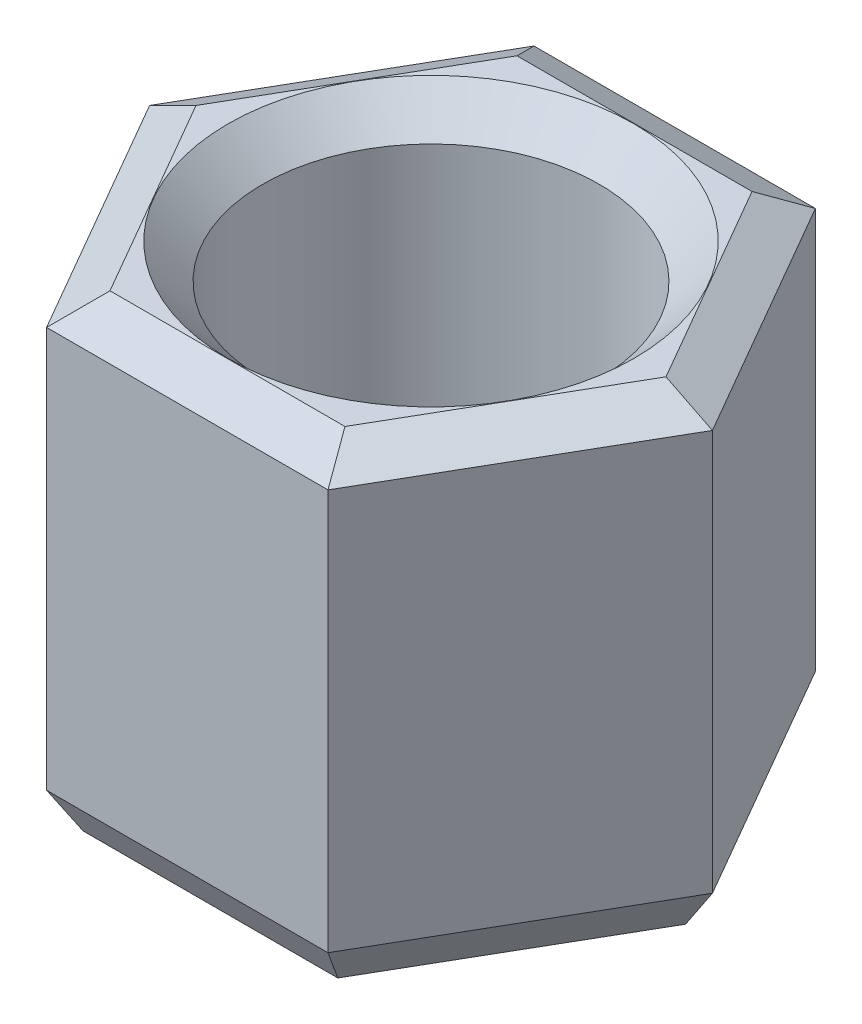
ISO-10303-21;
HEADER;
FILE_DESCRIPTION(('STEP AP214'),'2;1');
FILE_NAME('part.step','',(''),(''),'','','');
FILE_SCHEMA(('AUTOMOTIVE_DESIGN { 1 0 10303 214 1 1 1 1 }'));
ENDSEC;
DATA;
#1=APPLICATION_CONTEXT('core data for automotive mechanical design processes');
#2=APPLICATION_PROTOCOL_DEFINITION('international standard','automotive_design',2000,#1);
#3=PRODUCT_CONTEXT('',#1,'mechanical');
#4=PRODUCT('Part','Part','',(#3));
#5=PRODUCT_RELATED_PRODUCT_CATEGORY('part','',(#4));
#6=PRODUCT_DEFINITION_FORMATION('','',#4);
#7=PRODUCT_DEFINITION_CONTEXT('part definition',#1,'design');
#8=PRODUCT_DEFINITION('design','',#6,#7);
#9=PRODUCT_DEFINITION_SHAPE('','',#8);
#10=(LENGTH_UNIT() NAMED_UNIT(*) SI_UNIT(.MILLI.,.METRE.));
#11=(NAMED_UNIT(*) PLANE_ANGLE_UNIT() SI_UNIT($,.RADIAN.));
#12=(NAMED_UNIT(*) SI_UNIT($,.STERADIAN.) SOLID_ANGLE_UNIT());
#13=UNCERTAINTY_MEASURE_WITH_UNIT(LENGTH_MEASURE(1.E-05),#10,'distance_accuracy_value','');
#14=(GEOMETRIC_REPRESENTATION_CONTEXT(3) GLOBAL_UNCERTAINTY_ASSIGNED_CONTEXT((#13)) GLOBAL_UNIT_ASSIGNED_CONTEXT((#10,
#11,#12)) REPRESENTATION_CONTEXT('',''));
#15=CARTESIAN_POINT('',(0.,0.,0.));
#16=DIRECTION('',(0.,0.,1.));
#17=DIRECTION('',(1.,0.,0.));
#18=AXIS2_PLACEMENT_3D('',#15,#16,#17);
#19=CARTESIAN_POINT('',(0.,10.,0.));
#20=DIRECTION('',(0.,1.,0.));
#21=DIRECTION('',(0.,0.,1.));
#22=AXIS2_PLACEMENT_3D('',#19,#20,#21);
#23=CONICAL_SURFACE('',#22,8.75,0.785398163397449);
#24=CARTESIAN_POINT('',(0.,10.,0.));
#25=DIRECTION('',(0.,1.,0.));
#26=DIRECTION('',(0.,0.,1.));
#27=AXIS2_PLACEMENT_3D('',#24,#25,#26);
#28=CIRCLE('',#27,8.75);
#29=CARTESIAN_POINT('',(0.,10.,8.75));
#30=VERTEX_POINT('',#29);
#31=EDGE_CURVE('E265',#30,#30,#28,.F.);
#32=ORIENTED_EDGE('',*,*,#31,.F.);
#33=EDGE_LOOP('',(#32));
#34=FACE_BOUND('',#33,.T.);
#35=CARTESIAN_POINT('',(0.,8.5,0.));
#36=DIRECTION('',(0.,1.,0.));
#37=DIRECTION('',(0.,0.,1.));
#38=AXIS2_PLACEMENT_3D('',#35,#36,#37);
#39=CIRCLE('',#38,7.25);
#40=CARTESIAN_POINT('',(0.,8.5,7.25));
#41=VERTEX_POINT('',#40);
#42=EDGE_CURVE('E149',#41,#41,#39,.T.);
#43=ORIENTED_EDGE('',*,*,#42,.F.);
#44=EDGE_LOOP('',(#43));
#45=FACE_BOUND('',#44,.T.);
#46=ADVANCED_FACE('F39',(#34,#45),#23,.F.);
#47=CARTESIAN_POINT('',(0.,10.,0.));
#48=DIRECTION('',(0.,1.,0.));
#49=DIRECTION('',(0.,0.,1.));
#50=AXIS2_PLACEMENT_3D('',#47,#48,#49);
#51=PLANE('',#50);
#52=DIRECTION('',(-1.,0.,0.));
#53=VECTOR('',#52,1.);
#54=CARTESIAN_POINT('',(-6.06217782649118,10.,-8.76794919243106));
#55=LINE('',#54,#53);
#56=CARTESIAN_POINT('',(5.062177826491,10.,-8.76794919243118));
#57=VERTEX_POINT('',#56);
#58=CARTESIAN_POINT('',(-5.06217782649119,10.,-8.76794919243108));
#59=VERTEX_POINT('',#58);
#60=EDGE_CURVE('E154',#57,#59,#55,.T.);
#61=ORIENTED_EDGE('',*,*,#60,.T.);
#62=DIRECTION('',(-0.499999999999995,0.,0.866025403784441));
#63=VECTOR('',#62,1.);
#64=CARTESIAN_POINT('',(-10.6243556529822,10.,0.866025403784428));
#65=LINE('',#64,#63);
#66=CARTESIAN_POINT('',(-10.1243556529822,10.,0.));
#67=VERTEX_POINT('',#66);
#68=EDGE_CURVE('E134',#59,#67,#65,.T.);
#69=ORIENTED_EDGE('',*,*,#68,.T.);
#70=DIRECTION('',(0.500000000000001,0.,0.866025403784438));
#71=VECTOR('',#70,1.);
#72=CARTESIAN_POINT('',(-4.56217782649106,10.,9.63397459621559));
#73=LINE('',#72,#71);
#74=CARTESIAN_POINT('',(-5.06217782649106,10.,8.76794919243114));
#75=VERTEX_POINT('',#74);
#76=EDGE_CURVE('E142',#67,#75,#73,.T.);
#77=ORIENTED_EDGE('',*,*,#76,.T.);
#78=DIRECTION('',(1.,0.,0.));
#79=VECTOR('',#78,1.);
#80=CARTESIAN_POINT('',(6.06217782649112,10.,8.76794919243111));
#81=LINE('',#80,#79);
#82=CARTESIAN_POINT('',(5.06217782649112,10.,8.76794919243111));
#83=VERTEX_POINT('',#82);
#84=EDGE_CURVE('E148',#75,#83,#81,.T.);
#85=ORIENTED_EDGE('',*,*,#84,.T.);
#86=DIRECTION('',(0.499999999999995,0.,-0.866025403784442));
#87=VECTOR('',#86,1.);
#88=CARTESIAN_POINT('',(10.6243556529821,10.,-0.866025403784512));
#89=LINE('',#88,#87);
#90=CARTESIAN_POINT('',(10.1243556529822,10.,0.));
#91=VERTEX_POINT('',#90);
#92=EDGE_CURVE('E271',#83,#91,#89,.T.);
#93=ORIENTED_EDGE('',*,*,#92,.T.);
#94=DIRECTION('',(-0.500000000000007,0.,-0.866025403784435));
#95=VECTOR('',#94,1.);
#96=CARTESIAN_POINT('',(4.56217782649099,10.,-9.63397459621562));
#97=LINE('',#96,#95);
#98=EDGE_CURVE('E160',#91,#57,#97,.T.);
#99=ORIENTED_EDGE('',*,*,#98,.T.);
#100=EDGE_LOOP('',(#61,#69,#77,#85,#93,#99));
#101=FACE_BOUND('',#100,.T.);
#102=ORIENTED_EDGE('',*,*,#31,.T.);
#103=EDGE_LOOP('',(#102));
#104=FACE_BOUND('',#103,.T.);
#105=ADVANCED_FACE('F151',(#101,#104),#51,.T.);
#106=CARTESIAN_POINT('',(0.,-10.,0.));
#107=DIRECTION('',(0.,1.,0.));
#108=DIRECTION('',(0.,0.,1.));
#109=AXIS2_PLACEMENT_3D('',#106,#107,#108);
#110=PLANE('',#109);
#111=DIRECTION('',(-0.500000000000001,0.,-0.866025403784438));
#112=VECTOR('',#111,1.);
#113=CARTESIAN_POINT('',(-8.22724133595216,-10.,4.75000000000001));
#114=LINE('',#113,#112);
#115=CARTESIAN_POINT('',(-5.48482755730143,-10.,9.50000000000002));
#116=VERTEX_POINT('',#115);
#117=CARTESIAN_POINT('',(-10.9696551146029,-10.,0.));
#118=VERTEX_POINT('',#117);
#119=EDGE_CURVE('E49',#116,#118,#114,.T.);
#120=ORIENTED_EDGE('',*,*,#119,.T.);
#121=DIRECTION('',(0.499999999999995,0.,-0.866025403784441));
#122=VECTOR('',#121,1.);
#123=CARTESIAN_POINT('',(-8.22724133595223,-10.,-4.74999999999997));
#124=LINE('',#123,#122);
#125=CARTESIAN_POINT('',(-5.48482755730156,-10.,-9.49999999999994));
#126=VERTEX_POINT('',#125);
#127=EDGE_CURVE('E13',#118,#126,#124,.T.);
#128=ORIENTED_EDGE('',*,*,#127,.T.);
#129=DIRECTION('',(1.,0.,0.));
#130=VECTOR('',#129,1.);
#131=CARTESIAN_POINT('',(0.,-10.,-9.5));
#132=LINE('',#131,#130);
#133=CARTESIAN_POINT('',(5.48482755730136,-10.,-9.50000000000006));
#134=VERTEX_POINT('',#133);
#135=EDGE_CURVE('E185',#126,#134,#132,.T.);
#136=ORIENTED_EDGE('',*,*,#135,.T.);
#137=DIRECTION('',(0.500000000000007,0.,0.866025403784435));
#138=VECTOR('',#137,1.);
#139=CARTESIAN_POINT('',(8.22724133595213,-10.,-4.75000000000006));
#140=LINE('',#139,#138);
#141=CARTESIAN_POINT('',(10.9696551146029,-10.,0.));
#142=VERTEX_POINT('',#141);
#143=EDGE_CURVE('E187',#134,#142,#140,.T.);
#144=ORIENTED_EDGE('',*,*,#143,.T.);
#145=DIRECTION('',(-0.499999999999995,0.,0.866025403784442));
#146=VECTOR('',#145,1.);
#147=CARTESIAN_POINT('',(8.2272413359522,-10.,4.74999999999995));
#148=LINE('',#147,#146);
#149=CARTESIAN_POINT('',(5.48482755730149,-10.,9.49999999999998));
#150=VERTEX_POINT('',#149);
#151=EDGE_CURVE('E189',#142,#150,#148,.T.);
#152=ORIENTED_EDGE('',*,*,#151,.T.);
#153=DIRECTION('',(-1.,0.,0.));
#154=VECTOR('',#153,1.);
#155=CARTESIAN_POINT('',(0.,-10.,9.5));
#156=LINE('',#155,#154);
#157=EDGE_CURVE('E60',#150,#116,#156,.T.);
#158=ORIENTED_EDGE('',*,*,#157,.T.);
#159=EDGE_LOOP('',(#120,#128,#136,#144,#152,#158));
#160=FACE_BOUND('',#159,.T.);
#161=CARTESIAN_POINT('',(0.,-10.,0.));
#162=DIRECTION('',(0.,1.,0.));
#163=DIRECTION('',(0.,0.,1.));
#164=AXIS2_PLACEMENT_3D('',#161,#162,#163);
#165=CIRCLE('',#164,7.25);
#166=CARTESIAN_POINT('',(0.,-10.,7.25));
#167=VERTEX_POINT('',#166);
#168=EDGE_CURVE('E204',#167,#167,#165,.T.);
#169=ORIENTED_EDGE('',*,*,#168,.T.);
#170=EDGE_LOOP('',(#169));
#171=FACE_BOUND('',#170,.T.);
#172=ADVANCED_FACE('F229',(#160,#171),#110,.F.);
#173=CARTESIAN_POINT('',(-6.0621778264912,10.,-10.4999999999999));
#174=DIRECTION('',(0.866025403784442,0.,0.499999999999995));
#175=DIRECTION('',(0.499999999999995,0.,-0.866025403784442));
#176=AXIS2_PLACEMENT_3D('',#173,#174,#175);
#177=PLANE('',#176);
#178=DIRECTION('',(0.,-1.,0.));
#179=VECTOR('',#178,1.);
#180=CARTESIAN_POINT('',(-12.1243556529822,10.,0.));
#181=LINE('',#180,#179);
#182=CARTESIAN_POINT('',(-12.1243556529822,9.,0.));
#183=VERTEX_POINT('',#182);
#184=CARTESIAN_POINT('',(-12.1243556529822,-8.26794919243112,0.));
#185=VERTEX_POINT('',#184);
#186=EDGE_CURVE('E263',#183,#185,#181,.T.);
#187=ORIENTED_EDGE('',*,*,#186,.F.);
#188=DIRECTION('',(0.499999999999995,0.,-0.866025403784442));
#189=VECTOR('',#188,1.);
#190=CARTESIAN_POINT('',(-6.0621778264912,9.,-10.4999999999999));
#191=LINE('',#190,#189);
#192=CARTESIAN_POINT('',(-6.0621778264912,9.,-10.4999999999999));
#193=VERTEX_POINT('',#192);
#194=EDGE_CURVE('E136',#183,#193,#191,.T.);
#195=ORIENTED_EDGE('',*,*,#194,.T.);
#196=DIRECTION('',(0.,-1.,0.));
#197=VECTOR('',#196,1.);
#198=CARTESIAN_POINT('',(-6.0621778264912,10.,-10.4999999999999));
#199=LINE('',#198,#197);
#200=CARTESIAN_POINT('',(-6.0621778264912,-8.26794919243112,-10.4999999999999));
#201=VERTEX_POINT('',#200);
#202=EDGE_CURVE('E242',#193,#201,#199,.T.);
#203=ORIENTED_EDGE('',*,*,#202,.T.);
#204=DIRECTION('',(-0.499999999999995,0.,0.866025403784442));
#205=VECTOR('',#204,1.);
#206=CARTESIAN_POINT('',(-6.0621778264912,-8.26794919243113,-10.4999999999999));
#207=LINE('',#206,#205);
#208=EDGE_CURVE('E156',#201,#185,#207,.T.);
#209=ORIENTED_EDGE('',*,*,#208,.T.);
#210=EDGE_LOOP('',(#187,#195,#203,#209));
#211=FACE_BOUND('',#210,.T.);
#212=ADVANCED_FACE('F247',(#211),#177,.F.);
#213=CARTESIAN_POINT('',(-12.1243556529822,10.,0.));
#214=DIRECTION('',(0.866025403784438,0.,-0.500000000000001));
#215=DIRECTION('',(-0.500000000000001,0.,-0.866025403784438));
#216=AXIS2_PLACEMENT_3D('',#213,#214,#215);
#217=PLANE('',#216);
#218=DIRECTION('',(0.,-1.,0.));
#219=VECTOR('',#218,1.);
#220=CARTESIAN_POINT('',(-6.06217782649105,10.,10.5));
#221=LINE('',#220,#219);
#222=CARTESIAN_POINT('',(-6.06217782649105,9.,10.5));
#223=VERTEX_POINT('',#222);
#224=CARTESIAN_POINT('',(-6.06217782649105,-8.26794919243112,10.5));
#225=VERTEX_POINT('',#224);
#226=EDGE_CURVE('E260',#223,#225,#221,.T.);
#227=ORIENTED_EDGE('',*,*,#226,.F.);
#228=DIRECTION('',(-0.500000000000001,0.,-0.866025403784438));
#229=VECTOR('',#228,1.);
#230=CARTESIAN_POINT('',(-12.1243556529822,9.,0.));
#231=LINE('',#230,#229);
#232=EDGE_CURVE('E183',#223,#183,#231,.T.);
#233=ORIENTED_EDGE('',*,*,#232,.T.);
#234=ORIENTED_EDGE('',*,*,#186,.T.);
#235=DIRECTION('',(0.500000000000001,0.,0.866025403784438));
#236=VECTOR('',#235,1.);
#237=CARTESIAN_POINT('',(-12.1243556529822,-8.26794919243112,0.));
#238=LINE('',#237,#236);
#239=EDGE_CURVE('E181',#185,#225,#238,.T.);
#240=ORIENTED_EDGE('',*,*,#239,.T.);
#241=EDGE_LOOP('',(#227,#233,#234,#240));
#242=FACE_BOUND('',#241,.T.);
#243=ADVANCED_FACE('F299',(#242),#217,.F.);
#244=CARTESIAN_POINT('',(-6.06217782649105,10.,10.5));
#245=DIRECTION('',(0.,0.,-1.));
#246=DIRECTION('',(-1.,0.,0.));
#247=AXIS2_PLACEMENT_3D('',#244,#245,#246);
#248=PLANE('',#247);
#249=DIRECTION('',(0.,-1.,0.));
#250=VECTOR('',#249,1.);
#251=CARTESIAN_POINT('',(6.06217782649112,10.,10.5));
#252=LINE('',#251,#250);
#253=CARTESIAN_POINT('',(6.06217782649112,9.,10.5));
#254=VERTEX_POINT('',#253);
#255=CARTESIAN_POINT('',(6.06217782649112,-8.26794919243112,10.5));
#256=VERTEX_POINT('',#255);
#257=EDGE_CURVE('E257',#254,#256,#252,.T.);
#258=ORIENTED_EDGE('',*,*,#257,.F.);
#259=DIRECTION('',(-1.,0.,0.));
#260=VECTOR('',#259,1.);
#261=CARTESIAN_POINT('',(-6.06217782649105,9.,10.5));
#262=LINE('',#261,#260);
#263=EDGE_CURVE('E179',#254,#223,#262,.T.);
#264=ORIENTED_EDGE('',*,*,#263,.T.);
#265=ORIENTED_EDGE('',*,*,#226,.T.);
#266=DIRECTION('',(1.,0.,0.));
#267=VECTOR('',#266,1.);
#268=CARTESIAN_POINT('',(-6.06217782649105,-8.26794919243112,10.5));
#269=LINE('',#268,#267);
#270=EDGE_CURVE('E177',#225,#256,#269,.T.);
#271=ORIENTED_EDGE('',*,*,#270,.T.);
#272=EDGE_LOOP('',(#258,#264,#265,#271));
#273=FACE_BOUND('',#272,.T.);
#274=ADVANCED_FACE('F297',(#273),#248,.F.);
#275=CARTESIAN_POINT('',(6.06217782649112,10.,10.5));
#276=DIRECTION('',(-0.866025403784442,0.,-0.499999999999995));
#277=DIRECTION('',(-0.499999999999995,0.,0.866025403784442));
#278=AXIS2_PLACEMENT_3D('',#275,#276,#277);
#279=PLANE('',#278);
#280=DIRECTION('',(0.,-1.,0.));
#281=VECTOR('',#280,1.);
#282=CARTESIAN_POINT('',(12.1243556529822,10.,0.));
#283=LINE('',#282,#281);
#284=CARTESIAN_POINT('',(12.1243556529822,9.,0.));
#285=VERTEX_POINT('',#284);
#286=CARTESIAN_POINT('',(12.1243556529822,-8.26794919243112,0.));
#287=VERTEX_POINT('',#286);
#288=EDGE_CURVE('E250',#285,#287,#283,.T.);
#289=ORIENTED_EDGE('',*,*,#288,.F.);
#290=DIRECTION('',(-0.499999999999995,0.,0.866025403784442));
#291=VECTOR('',#290,1.);
#292=CARTESIAN_POINT('',(6.06217782649112,9.,10.5));
#293=LINE('',#292,#291);
#294=EDGE_CURVE('E175',#285,#254,#293,.T.);
#295=ORIENTED_EDGE('',*,*,#294,.T.);
#296=ORIENTED_EDGE('',*,*,#257,.T.);
#297=DIRECTION('',(0.499999999999995,0.,-0.866025403784442));
#298=VECTOR('',#297,1.);
#299=CARTESIAN_POINT('',(6.06217782649112,-8.26794919243112,10.5));
#300=LINE('',#299,#298);
#301=EDGE_CURVE('E173',#256,#287,#300,.T.);
#302=ORIENTED_EDGE('',*,*,#301,.T.);
#303=EDGE_LOOP('',(#289,#295,#296,#302));
#304=FACE_BOUND('',#303,.T.);
#305=ADVANCED_FACE('F287',(#304),#279,.F.);
#306=CARTESIAN_POINT('',(12.1243556529822,10.,0.));
#307=DIRECTION('',(-0.866025403784435,0.,0.500000000000007));
#308=DIRECTION('',(0.500000000000007,0.,0.866025403784435));
#309=AXIS2_PLACEMENT_3D('',#306,#307,#308);
#310=PLANE('',#309);
#311=DIRECTION('',(0.,-1.,0.));
#312=VECTOR('',#311,1.);
#313=CARTESIAN_POINT('',(6.06217782649098,10.,-10.5000000000001));
#314=LINE('',#313,#312);
#315=CARTESIAN_POINT('',(6.06217782649098,9.,-10.5000000000001));
#316=VERTEX_POINT('',#315);
#317=CARTESIAN_POINT('',(6.06217782649098,-8.26794919243112,-10.5000000000001));
#318=VERTEX_POINT('',#317);
#319=EDGE_CURVE('E244',#316,#318,#314,.T.);
#320=ORIENTED_EDGE('',*,*,#319,.F.);
#321=DIRECTION('',(0.500000000000007,0.,0.866025403784435));
#322=VECTOR('',#321,1.);
#323=CARTESIAN_POINT('',(12.1243556529822,9.,0.));
#324=LINE('',#323,#322);
#325=EDGE_CURVE('E171',#316,#285,#324,.T.);
#326=ORIENTED_EDGE('',*,*,#325,.T.);
#327=ORIENTED_EDGE('',*,*,#288,.T.);
#328=DIRECTION('',(-0.500000000000007,0.,-0.866025403784435));
#329=VECTOR('',#328,1.);
#330=CARTESIAN_POINT('',(12.1243556529822,-8.26794919243112,0.));
#331=LINE('',#330,#329);
#332=EDGE_CURVE('E169',#287,#318,#331,.T.);
#333=ORIENTED_EDGE('',*,*,#332,.T.);
#334=EDGE_LOOP('',(#320,#326,#327,#333));
#335=FACE_BOUND('',#334,.T.);
#336=ADVANCED_FACE('F283',(#335),#310,.F.);
#337=CARTESIAN_POINT('',(6.06217782649098,10.,-10.5000000000001));
#338=DIRECTION('',(0.,0.,1.));
#339=DIRECTION('',(1.,0.,0.));
#340=AXIS2_PLACEMENT_3D('',#337,#338,#339);
#341=PLANE('',#340);
#342=ORIENTED_EDGE('',*,*,#202,.F.);
#343=DIRECTION('',(1.,0.,0.));
#344=VECTOR('',#343,1.);
#345=CARTESIAN_POINT('',(6.06217782649098,9.,-10.5000000000001));
#346=LINE('',#345,#344);
#347=EDGE_CURVE('E167',#193,#316,#346,.T.);
#348=ORIENTED_EDGE('',*,*,#347,.T.);
#349=ORIENTED_EDGE('',*,*,#319,.T.);
#350=DIRECTION('',(-1.,0.,0.));
#351=VECTOR('',#350,1.);
#352=CARTESIAN_POINT('',(6.06217782649098,-8.26794919243112,-10.5000000000001));
#353=LINE('',#352,#351);
#354=EDGE_CURVE('E165',#318,#201,#353,.T.);
#355=ORIENTED_EDGE('',*,*,#354,.T.);
#356=EDGE_LOOP('',(#342,#348,#349,#355));
#357=FACE_BOUND('',#356,.T.);
#358=ADVANCED_FACE('F241',(#357),#341,.F.);
#359=CARTESIAN_POINT('',(0.,10.,0.));
#360=DIRECTION('',(0.,-1.,0.));
#361=DIRECTION('',(0.,0.,-1.));
#362=AXIS2_PLACEMENT_3D('',#359,#360,#361);
#363=CYLINDRICAL_SURFACE('',#362,7.25);
#364=ORIENTED_EDGE('',*,*,#42,.T.);
#365=EDGE_LOOP('',(#364));
#366=FACE_BOUND('',#365,.T.);
#367=ORIENTED_EDGE('',*,*,#168,.F.);
#368=EDGE_LOOP('',(#367));
#369=FACE_BOUND('',#368,.T.);
#370=ADVANCED_FACE('F358',(#366,#369),#363,.F.);
#371=CARTESIAN_POINT('',(7.59326673973664,10.,4.38397459621552));
#372=DIRECTION('',(0.433012701892222,0.866025403784438,0.249999999999998));
#373=DIRECTION('',(-0.499999999999995,0.,0.866025403784442));
#374=AXIS2_PLACEMENT_3D('',#371,#372,#373);
#375=PLANE('',#374);
#376=DIRECTION('',(-0.447213595499961,0.447213595499959,-0.774596669241481));
#377=VECTOR('',#376,1.);
#378=CARTESIAN_POINT('',(4.0497422611929,11.0124355652982,7.01435935394488));
#379=LINE('',#378,#377);
#380=EDGE_CURVE('E198',#254,#83,#379,.T.);
#381=ORIENTED_EDGE('',*,*,#380,.F.);
#382=ORIENTED_EDGE('',*,*,#294,.F.);
#383=DIRECTION('',(-0.894427190999915,0.447213595499959,0.));
#384=VECTOR('',#383,1.);
#385=CARTESIAN_POINT('',(8.09948452238572,11.0124355652982,0.));
#386=LINE('',#385,#384);
#387=EDGE_CURVE('E201',#91,#285,#386,.F.);
#388=ORIENTED_EDGE('',*,*,#387,.F.);
#389=ORIENTED_EDGE('',*,*,#92,.F.);
#390=EDGE_LOOP('',(#381,#382,#388,#389));
#391=FACE_BOUND('',#390,.T.);
#392=ADVANCED_FACE('F291',(#391),#375,.T.);
#393=CARTESIAN_POINT('',(7.59326673973658,10.,-4.38397459621563));
#394=DIRECTION('',(0.433012701892218,0.866025403784438,-0.250000000000004));
#395=DIRECTION('',(0.500000000000007,0.,0.866025403784435));
#396=AXIS2_PLACEMENT_3D('',#393,#394,#395);
#397=PLANE('',#396);
#398=ORIENTED_EDGE('',*,*,#387,.T.);
#399=ORIENTED_EDGE('',*,*,#325,.F.);
#400=DIRECTION('',(-0.44721359549995,0.447213595499959,0.774596669241487));
#401=VECTOR('',#400,1.);
#402=CARTESIAN_POINT('',(4.04974226119279,11.0124355652982,-7.01435935394494));
#403=LINE('',#402,#401);
#404=EDGE_CURVE('E195',#57,#316,#403,.F.);
#405=ORIENTED_EDGE('',*,*,#404,.F.);
#406=ORIENTED_EDGE('',*,*,#98,.F.);
#407=EDGE_LOOP('',(#398,#399,#405,#406));
#408=FACE_BOUND('',#407,.T.);
#409=ADVANCED_FACE('F278',(#408),#397,.T.);
#410=CARTESIAN_POINT('',(0.,10.,8.76794919243113));
#411=DIRECTION('',(0.,0.866025403784438,0.500000000000001));
#412=DIRECTION('',(-1.,0.,0.));
#413=AXIS2_PLACEMENT_3D('',#410,#411,#412);
#414=PLANE('',#413);
#415=ORIENTED_EDGE('',*,*,#380,.T.);
#416=ORIENTED_EDGE('',*,*,#84,.F.);
#417=DIRECTION('',(0.447213595499955,0.447213595499959,-0.774596669241485));
#418=VECTOR('',#417,1.);
#419=CARTESIAN_POINT('',(-4.04974226119285,11.0124355652982,7.01435935394491));
#420=LINE('',#419,#418);
#421=EDGE_CURVE('E145',#223,#75,#420,.T.);
#422=ORIENTED_EDGE('',*,*,#421,.F.);
#423=ORIENTED_EDGE('',*,*,#263,.F.);
#424=EDGE_LOOP('',(#415,#416,#422,#423));
#425=FACE_BOUND('',#424,.T.);
#426=ADVANCED_FACE('F294',(#425),#414,.T.);
#427=CARTESIAN_POINT('',(0.,10.,-8.76794919243113));
#428=DIRECTION('',(0.,0.866025403784438,-0.500000000000001));
#429=DIRECTION('',(1.,0.,0.));
#430=AXIS2_PLACEMENT_3D('',#427,#428,#429);
#431=PLANE('',#430);
#432=ORIENTED_EDGE('',*,*,#404,.T.);
#433=ORIENTED_EDGE('',*,*,#347,.F.);
#434=DIRECTION('',(0.447213595499964,0.447213595499959,0.774596669241479));
#435=VECTOR('',#434,1.);
#436=CARTESIAN_POINT('',(-4.04974226119296,11.0124355652982,-7.01435935394486));
#437=LINE('',#436,#435);
#438=EDGE_CURVE('E139',#59,#193,#437,.F.);
#439=ORIENTED_EDGE('',*,*,#438,.F.);
#440=ORIENTED_EDGE('',*,*,#60,.F.);
#441=EDGE_LOOP('',(#432,#433,#439,#440));
#442=FACE_BOUND('',#441,.T.);
#443=ADVANCED_FACE('F281',(#442),#431,.T.);
#444=CARTESIAN_POINT('',(-7.59326673973661,10.,4.38397459621557));
#445=DIRECTION('',(-0.43301270189222,0.866025403784438,0.250000000000001));
#446=DIRECTION('',(-0.500000000000001,0.,-0.866025403784438));
#447=AXIS2_PLACEMENT_3D('',#444,#445,#446);
#448=PLANE('',#447);
#449=ORIENTED_EDGE('',*,*,#421,.T.);
#450=ORIENTED_EDGE('',*,*,#76,.F.);
#451=DIRECTION('',(-0.894427190999915,-0.44721359549996,0.));
#452=VECTOR('',#451,1.);
#453=CARTESIAN_POINT('',(-8.09948452238573,11.0124355652982,0.));
#454=LINE('',#453,#452);
#455=EDGE_CURVE('E130',#183,#67,#454,.F.);
#456=ORIENTED_EDGE('',*,*,#455,.F.);
#457=ORIENTED_EDGE('',*,*,#232,.F.);
#458=EDGE_LOOP('',(#449,#450,#456,#457));
#459=FACE_BOUND('',#458,.T.);
#460=ADVANCED_FACE('F143',(#459),#448,.T.);
#461=CARTESIAN_POINT('',(-7.59326673973667,10.,-4.38397459621554));
#462=DIRECTION('',(-0.433012701892222,0.866025403784438,-0.249999999999998));
#463=DIRECTION('',(0.499999999999995,0.,-0.866025403784442));
#464=AXIS2_PLACEMENT_3D('',#461,#462,#463);
#465=PLANE('',#464);
#466=ORIENTED_EDGE('',*,*,#438,.T.);
#467=ORIENTED_EDGE('',*,*,#194,.F.);
#468=ORIENTED_EDGE('',*,*,#455,.T.);
#469=ORIENTED_EDGE('',*,*,#68,.F.);
#470=EDGE_LOOP('',(#466,#467,#468,#469));
#471=FACE_BOUND('',#470,.T.);
#472=ADVANCED_FACE('F132',(#471),#465,.T.);
#473=CARTESIAN_POINT('',(6.06217782649112,-8.26794919243112,10.5));
#474=DIRECTION('',(-0.750000000000002,0.500000000000001,-0.433012701892214));
#475=DIRECTION('',(0.499999999999995,0.,-0.866025403784442));
#476=AXIS2_PLACEMENT_3D('',#473,#474,#475);
#477=PLANE('',#476);
#478=DIRECTION('',(-0.277350098112617,-0.832050294337843,-0.480384461415261));
#479=VECTOR('',#478,1.);
#480=CARTESIAN_POINT('',(6.06217782649112,-8.26794919243112,10.5));
#481=LINE('',#480,#479);
#482=EDGE_CURVE('E214',#150,#256,#481,.F.);
#483=ORIENTED_EDGE('',*,*,#482,.F.);
#484=ORIENTED_EDGE('',*,*,#151,.F.);
#485=DIRECTION('',(-0.554700196225231,-0.832050294337843,0.));
#486=VECTOR('',#485,1.);
#487=CARTESIAN_POINT('',(12.1243556529822,-8.26794919243112,0.));
#488=LINE('',#487,#486);
#489=EDGE_CURVE('E44',#287,#142,#488,.T.);
#490=ORIENTED_EDGE('',*,*,#489,.F.);
#491=ORIENTED_EDGE('',*,*,#301,.F.);
#492=EDGE_LOOP('',(#483,#484,#490,#491));
#493=FACE_BOUND('',#492,.T.);
#494=ADVANCED_FACE('F42',(#493),#477,.F.);
#495=CARTESIAN_POINT('',(12.1243556529822,-8.26794919243112,0.));
#496=DIRECTION('',(-0.749999999999996,0.500000000000002,0.433012701892225));
#497=DIRECTION('',(-0.500000000000007,0.,-0.866025403784435));
#498=AXIS2_PLACEMENT_3D('',#495,#496,#497);
#499=PLANE('',#498);
#500=ORIENTED_EDGE('',*,*,#489,.T.);
#501=ORIENTED_EDGE('',*,*,#143,.F.);
#502=DIRECTION('',(-0.277350098112612,-0.832050294337843,0.480384461415265));
#503=VECTOR('',#502,1.);
#504=CARTESIAN_POINT('',(6.06217782649098,-8.26794919243112,-10.5000000000001));
#505=LINE('',#504,#503);
#506=EDGE_CURVE('E212',#318,#134,#505,.T.);
#507=ORIENTED_EDGE('',*,*,#506,.F.);
#508=ORIENTED_EDGE('',*,*,#332,.F.);
#509=EDGE_LOOP('',(#500,#501,#507,#508));
#510=FACE_BOUND('',#509,.T.);
#511=ADVANCED_FACE('F224',(#510),#499,.F.);
#512=CARTESIAN_POINT('',(-6.06217782649105,-8.26794919243112,10.5));
#513=DIRECTION('',(0.,0.500000000000001,-0.866025403784438));
#514=DIRECTION('',(1.,0.,0.));
#515=AXIS2_PLACEMENT_3D('',#512,#513,#514);
#516=PLANE('',#515);
#517=ORIENTED_EDGE('',*,*,#482,.T.);
#518=ORIENTED_EDGE('',*,*,#270,.F.);
#519=DIRECTION('',(0.277350098112614,-0.832050294337843,-0.480384461415263));
#520=VECTOR('',#519,1.);
#521=CARTESIAN_POINT('',(-6.06217782649105,-8.26794919243112,10.5));
#522=LINE('',#521,#520);
#523=EDGE_CURVE('E209',#116,#225,#522,.F.);
#524=ORIENTED_EDGE('',*,*,#523,.F.);
#525=ORIENTED_EDGE('',*,*,#157,.F.);
#526=EDGE_LOOP('',(#517,#518,#524,#525));
#527=FACE_BOUND('',#526,.T.);
#528=ADVANCED_FACE('F304',(#527),#516,.F.);
#529=CARTESIAN_POINT('',(6.06217782649098,-8.26794919243112,-10.5000000000001));
#530=DIRECTION('',(0.,0.500000000000001,0.866025403784438));
#531=DIRECTION('',(-1.,0.,0.));
#532=AXIS2_PLACEMENT_3D('',#529,#530,#531);
#533=PLANE('',#532);
#534=ORIENTED_EDGE('',*,*,#506,.T.);
#535=ORIENTED_EDGE('',*,*,#135,.F.);
#536=DIRECTION('',(-0.27735009811262,0.832050294337843,-0.48038446141526));
#537=VECTOR('',#536,1.);
#538=CARTESIAN_POINT('',(-5.12953508395409,-11.0658774200424,-8.88461538461532));
#539=LINE('',#538,#537);
#540=EDGE_CURVE('E207',#201,#126,#539,.F.);
#541=ORIENTED_EDGE('',*,*,#540,.F.);
#542=ORIENTED_EDGE('',*,*,#354,.F.);
#543=EDGE_LOOP('',(#534,#535,#541,#542));
#544=FACE_BOUND('',#543,.T.);
#545=ADVANCED_FACE('F234',(#544),#533,.F.);
#546=CARTESIAN_POINT('',(-12.1243556529822,-8.26794919243112,0.));
#547=DIRECTION('',(0.749999999999999,0.500000000000001,-0.43301270189222));
#548=DIRECTION('',(0.500000000000001,0.,0.866025403784438));
#549=AXIS2_PLACEMENT_3D('',#546,#547,#548);
#550=PLANE('',#549);
#551=ORIENTED_EDGE('',*,*,#523,.T.);
#552=ORIENTED_EDGE('',*,*,#239,.F.);
#553=DIRECTION('',(0.55470019622523,-0.832050294337843,0.));
#554=VECTOR('',#553,1.);
#555=CARTESIAN_POINT('',(-12.1243556529822,-8.26794919243112,0.));
#556=LINE('',#555,#554);
#557=EDGE_CURVE('E205',#118,#185,#556,.F.);
#558=ORIENTED_EDGE('',*,*,#557,.F.);
#559=ORIENTED_EDGE('',*,*,#119,.F.);
#560=EDGE_LOOP('',(#551,#552,#558,#559));
#561=FACE_BOUND('',#560,.T.);
#562=ADVANCED_FACE('F303',(#561),#550,.F.);
#563=CARTESIAN_POINT('',(-6.0621778264912,-8.26794919243112,-10.4999999999999));
#564=DIRECTION('',(0.750000000000001,0.500000000000002,0.433012701892214));
#565=DIRECTION('',(-0.499999999999995,0.,0.866025403784442));
#566=AXIS2_PLACEMENT_3D('',#563,#564,#565);
#567=PLANE('',#566);
#568=ORIENTED_EDGE('',*,*,#540,.T.);
#569=ORIENTED_EDGE('',*,*,#127,.F.);
#570=ORIENTED_EDGE('',*,*,#557,.T.);
#571=ORIENTED_EDGE('',*,*,#208,.F.);
#572=EDGE_LOOP('',(#568,#569,#570,#571));
#573=FACE_BOUND('',#572,.T.);
#574=ADVANCED_FACE('F360',(#573),#567,.F.);
#575=CLOSED_SHELL('',(#46,#105,#172,#212,#243,#274,#305,#336,#358,#370,#392,#409,#426,#443,#460,
#472,#494,#511,#528,#545,#562,#574));
#576=MANIFOLD_SOLID_BREP('B2',#575);
#577=ADVANCED_BREP_SHAPE_REPRESENTATION('',(#18,#576),#14);
#578=SHAPE_DEFINITION_REPRESENTATION(#9,#577);
ENDSEC;
END-ISO-10303-21;
